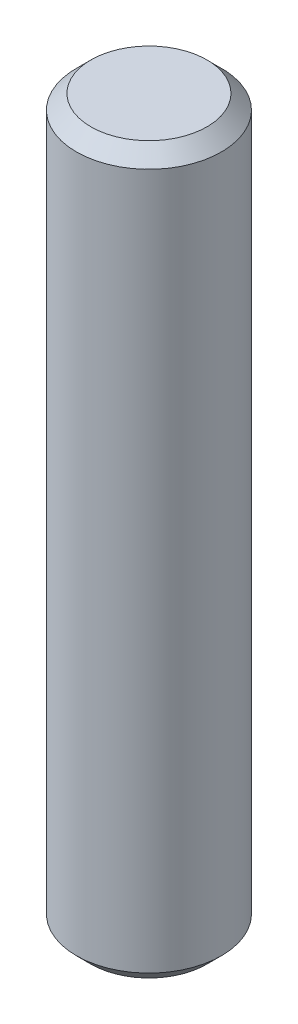
ISO-10303-21;
HEADER;
FILE_DESCRIPTION(('STEP AP214'),'2;1');
FILE_NAME('part.step','',(''),(''),'','','');
FILE_SCHEMA(('AUTOMOTIVE_DESIGN { 1 0 10303 214 1 1 1 1 }'));
ENDSEC;
DATA;
#1=APPLICATION_CONTEXT('core data for automotive mechanical design processes');
#2=APPLICATION_PROTOCOL_DEFINITION('international standard','automotive_design',2000,#1);
#3=PRODUCT_CONTEXT('',#1,'mechanical');
#4=PRODUCT('Part','Part','',(#3));
#5=PRODUCT_RELATED_PRODUCT_CATEGORY('part','',(#4));
#6=PRODUCT_DEFINITION_FORMATION('','',#4);
#7=PRODUCT_DEFINITION_CONTEXT('part definition',#1,'design');
#8=PRODUCT_DEFINITION('design','',#6,#7);
#9=PRODUCT_DEFINITION_SHAPE('','',#8);
#10=(LENGTH_UNIT() NAMED_UNIT(*) SI_UNIT(.MILLI.,.METRE.));
#11=(NAMED_UNIT(*) PLANE_ANGLE_UNIT() SI_UNIT($,.RADIAN.));
#12=(NAMED_UNIT(*) SI_UNIT($,.STERADIAN.) SOLID_ANGLE_UNIT());
#13=UNCERTAINTY_MEASURE_WITH_UNIT(LENGTH_MEASURE(1.E-05),#10,'distance_accuracy_value','');
#14=(GEOMETRIC_REPRESENTATION_CONTEXT(3) GLOBAL_UNCERTAINTY_ASSIGNED_CONTEXT((#13)) GLOBAL_UNIT_ASSIGNED_CONTEXT((#10,
#11,#12)) REPRESENTATION_CONTEXT('',''));
#15=CARTESIAN_POINT('',(0.,0.,0.));
#16=DIRECTION('',(0.,0.,1.));
#17=DIRECTION('',(1.,0.,0.));
#18=AXIS2_PLACEMENT_3D('',#15,#16,#17);
#19=CARTESIAN_POINT('',(0.,50.,0.));
#20=DIRECTION('',(0.,-1.,0.));
#21=DIRECTION('',(0.,0.,-1.));
#22=AXIS2_PLACEMENT_3D('',#19,#20,#21);
#23=CYLINDRICAL_SURFACE('',#22,5.);
#24=CARTESIAN_POINT('',(0.,49.,0.));
#25=DIRECTION('',(0.,1.,0.));
#26=DIRECTION('',(0.,0.,1.));
#27=AXIS2_PLACEMENT_3D('',#24,#25,#26);
#28=CIRCLE('',#27,5.);
#29=CARTESIAN_POINT('',(0.,49.,5.));
#30=VERTEX_POINT('',#29);
#31=EDGE_CURVE('E45',#30,#30,#28,.F.);
#32=ORIENTED_EDGE('',*,*,#31,.T.);
#33=EDGE_LOOP('',(#32));
#34=FACE_BOUND('',#33,.T.);
#35=CARTESIAN_POINT('',(0.,1.,0.));
#36=DIRECTION('',(0.,1.,0.));
#37=DIRECTION('',(0.,0.,1.));
#38=AXIS2_PLACEMENT_3D('',#35,#36,#37);
#39=CIRCLE('',#38,5.);
#40=CARTESIAN_POINT('',(0.,1.,5.));
#41=VERTEX_POINT('',#40);
#42=EDGE_CURVE('E50',#41,#41,#39,.T.);
#43=ORIENTED_EDGE('',*,*,#42,.T.);
#44=EDGE_LOOP('',(#43));
#45=FACE_BOUND('',#44,.T.);
#46=ADVANCED_FACE('F37',(#34,#45),#23,.T.);
#47=CARTESIAN_POINT('',(0.,50.,0.));
#48=DIRECTION('',(0.,1.,0.));
#49=DIRECTION('',(0.,0.,1.));
#50=AXIS2_PLACEMENT_3D('',#47,#48,#49);
#51=PLANE('',#50);
#52=CARTESIAN_POINT('',(0.,50.,0.));
#53=DIRECTION('',(0.,1.,0.));
#54=DIRECTION('',(0.,0.,1.));
#55=AXIS2_PLACEMENT_3D('',#52,#53,#54);
#56=CIRCLE('',#55,3.99999999999999);
#57=CARTESIAN_POINT('',(0.,50.,3.99999999999999));
#58=VERTEX_POINT('',#57);
#59=EDGE_CURVE('E55',#58,#58,#56,.T.);
#60=ORIENTED_EDGE('',*,*,#59,.T.);
#61=EDGE_LOOP('',(#60));
#62=FACE_BOUND('',#61,.T.);
#63=ADVANCED_FACE('F62',(#62),#51,.T.);
#64=CARTESIAN_POINT('',(0.,0.,0.));
#65=DIRECTION('',(0.,1.,0.));
#66=DIRECTION('',(0.,0.,1.));
#67=AXIS2_PLACEMENT_3D('',#64,#65,#66);
#68=PLANE('',#67);
#69=CARTESIAN_POINT('',(0.,0.,0.));
#70=DIRECTION('',(0.,1.,0.));
#71=DIRECTION('',(0.,0.,1.));
#72=AXIS2_PLACEMENT_3D('',#69,#70,#71);
#73=CIRCLE('',#72,3.99999999999999);
#74=CARTESIAN_POINT('',(0.,0.,3.99999999999999));
#75=VERTEX_POINT('',#74);
#76=EDGE_CURVE('E10',#75,#75,#73,.F.);
#77=ORIENTED_EDGE('',*,*,#76,.T.);
#78=EDGE_LOOP('',(#77));
#79=FACE_BOUND('',#78,.T.);
#80=ADVANCED_FACE('F66',(#79),#68,.F.);
#81=CARTESIAN_POINT('',(0.,50.,0.));
#82=DIRECTION('',(0.,-1.,0.));
#83=DIRECTION('',(0.,0.,-1.));
#84=AXIS2_PLACEMENT_3D('',#81,#82,#83);
#85=CONICAL_SURFACE('',#84,3.99999999999999,0.785398163397446);
#86=ORIENTED_EDGE('',*,*,#31,.F.);
#87=EDGE_LOOP('',(#86));
#88=FACE_BOUND('',#87,.T.);
#89=ORIENTED_EDGE('',*,*,#59,.F.);
#90=EDGE_LOOP('',(#89));
#91=FACE_BOUND('',#90,.T.);
#92=ADVANCED_FACE('F64',(#88,#91),#85,.T.);
#93=CARTESIAN_POINT('',(0.,1.,0.));
#94=DIRECTION('',(0.,1.,0.));
#95=DIRECTION('',(0.,0.,1.));
#96=AXIS2_PLACEMENT_3D('',#93,#94,#95);
#97=CONICAL_SURFACE('',#96,5.,0.785398163397453);
#98=ORIENTED_EDGE('',*,*,#76,.F.);
#99=EDGE_LOOP('',(#98));
#100=FACE_BOUND('',#99,.T.);
#101=ORIENTED_EDGE('',*,*,#42,.F.);
#102=EDGE_LOOP('',(#101));
#103=FACE_BOUND('',#102,.T.);
#104=ADVANCED_FACE('F39',(#100,#103),#97,.T.);
#105=CLOSED_SHELL('',(#46,#63,#80,#92,#104));
#106=MANIFOLD_SOLID_BREP('B2',#105);
#107=ADVANCED_BREP_SHAPE_REPRESENTATION('',(#18,#106),#14);
#108=SHAPE_DEFINITION_REPRESENTATION(#9,#107);
ENDSEC;
END-ISO-10303-21;
